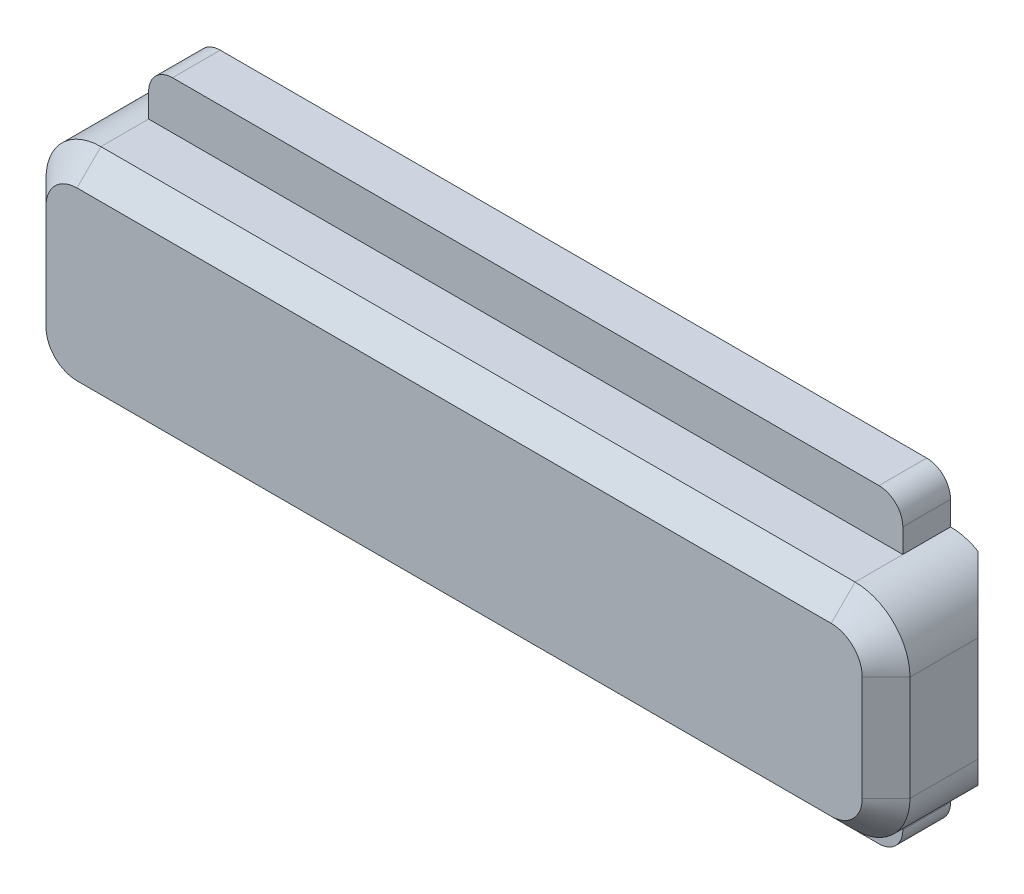
ISO-10303-21;
HEADER;
FILE_DESCRIPTION(('STEP AP214'),'2;1');
FILE_NAME('part.step','',(''),(''),'','','');
FILE_SCHEMA(('AUTOMOTIVE_DESIGN { 1 0 10303 214 1 1 1 1 }'));
ENDSEC;
DATA;
#1=APPLICATION_CONTEXT('core data for automotive mechanical design processes');
#2=APPLICATION_PROTOCOL_DEFINITION('international standard','automotive_design',2000,#1);
#3=PRODUCT_CONTEXT('',#1,'mechanical');
#4=PRODUCT('Part','Part','',(#3));
#5=PRODUCT_RELATED_PRODUCT_CATEGORY('part','',(#4));
#6=PRODUCT_DEFINITION_FORMATION('','',#4);
#7=PRODUCT_DEFINITION_CONTEXT('part definition',#1,'design');
#8=PRODUCT_DEFINITION('design','',#6,#7);
#9=PRODUCT_DEFINITION_SHAPE('','',#8);
#10=(LENGTH_UNIT() NAMED_UNIT(*) SI_UNIT(.MILLI.,.METRE.));
#11=(NAMED_UNIT(*) PLANE_ANGLE_UNIT() SI_UNIT($,.RADIAN.));
#12=(NAMED_UNIT(*) SI_UNIT($,.STERADIAN.) SOLID_ANGLE_UNIT());
#13=UNCERTAINTY_MEASURE_WITH_UNIT(LENGTH_MEASURE(1.E-05),#10,'distance_accuracy_value','');
#14=(GEOMETRIC_REPRESENTATION_CONTEXT(3) GLOBAL_UNCERTAINTY_ASSIGNED_CONTEXT((#13)) GLOBAL_UNIT_ASSIGNED_CONTEXT((#10,
#11,#12)) REPRESENTATION_CONTEXT('',''));
#15=CARTESIAN_POINT('',(0.,0.,0.));
#16=DIRECTION('',(0.,0.,1.));
#17=DIRECTION('',(1.,0.,0.));
#18=AXIS2_PLACEMENT_3D('',#15,#16,#17);
#19=CARTESIAN_POINT('',(7.9,-0.100000000000001,-2.5));
#20=DIRECTION('',(0.,1.,0.));
#21=DIRECTION('',(-1.,0.,0.));
#22=AXIS2_PLACEMENT_3D('',#19,#20,#21);
#23=PLANE('',#22);
#24=DIRECTION('',(0.,0.,1.));
#25=VECTOR('',#24,1.);
#26=CARTESIAN_POINT('',(-7.9,-0.100000000000001,-2.5));
#27=LINE('',#26,#25);
#28=CARTESIAN_POINT('',(-7.9,-0.100000000000001,-1.5));
#29=VERTEX_POINT('',#28);
#30=CARTESIAN_POINT('',(-7.9,-0.100000000000001,-0.499999999999997));
#31=VERTEX_POINT('',#30);
#32=EDGE_CURVE('E344',#29,#31,#27,.T.);
#33=ORIENTED_EDGE('',*,*,#32,.T.);
#34=DIRECTION('',(1.,0.,0.));
#35=VECTOR('',#34,1.);
#36=CARTESIAN_POINT('',(7.9,-0.100000000000001,-0.499999999999997));
#37=LINE('',#36,#35);
#38=CARTESIAN_POINT('',(7.9,-0.100000000000002,-0.499999999999997));
#39=VERTEX_POINT('',#38);
#40=EDGE_CURVE('E290',#31,#39,#37,.T.);
#41=ORIENTED_EDGE('',*,*,#40,.T.);
#42=DIRECTION('',(0.,0.,1.));
#43=VECTOR('',#42,1.);
#44=CARTESIAN_POINT('',(7.9,-0.100000000000002,-2.5));
#45=LINE('',#44,#43);
#46=CARTESIAN_POINT('',(7.9,-0.100000000000002,-1.5));
#47=VERTEX_POINT('',#46);
#48=EDGE_CURVE('E348',#47,#39,#45,.T.);
#49=ORIENTED_EDGE('',*,*,#48,.F.);
#50=DIRECTION('',(-1.,0.,0.));
#51=VECTOR('',#50,1.);
#52=CARTESIAN_POINT('',(7.9,-0.100000000000001,-1.5));
#53=LINE('',#52,#51);
#54=EDGE_CURVE('E331',#47,#29,#53,.T.);
#55=ORIENTED_EDGE('',*,*,#54,.T.);
#56=EDGE_LOOP('',(#33,#41,#49,#55));
#57=FACE_BOUND('',#56,.T.);
#58=ADVANCED_FACE('F36',(#57),#23,.T.);
#59=CARTESIAN_POINT('',(-7.9,-4.6,-2.5));
#60=DIRECTION('',(0.,-1.,0.));
#61=DIRECTION('',(0.,0.,-1.));
#62=AXIS2_PLACEMENT_3D('',#59,#60,#61);
#63=PLANE('',#62);
#64=DIRECTION('',(0.,0.,1.));
#65=VECTOR('',#64,1.);
#66=CARTESIAN_POINT('',(7.89999999999999,-4.6,-2.5));
#67=LINE('',#66,#65);
#68=CARTESIAN_POINT('',(7.9,-4.6,-1.5));
#69=VERTEX_POINT('',#68);
#70=CARTESIAN_POINT('',(7.89999999999999,-4.6,-0.499999999999997));
#71=VERTEX_POINT('',#70);
#72=EDGE_CURVE('E353',#69,#71,#67,.T.);
#73=ORIENTED_EDGE('',*,*,#72,.T.);
#74=DIRECTION('',(-1.,0.,0.));
#75=VECTOR('',#74,1.);
#76=CARTESIAN_POINT('',(-7.9,-4.6,-0.499999999999997));
#77=LINE('',#76,#75);
#78=CARTESIAN_POINT('',(-7.9,-4.6,-0.499999999999997));
#79=VERTEX_POINT('',#78);
#80=EDGE_CURVE('E279',#71,#79,#77,.T.);
#81=ORIENTED_EDGE('',*,*,#80,.T.);
#82=DIRECTION('',(0.,0.,1.));
#83=VECTOR('',#82,1.);
#84=CARTESIAN_POINT('',(-7.9,-4.6,-2.5));
#85=LINE('',#84,#83);
#86=CARTESIAN_POINT('',(-7.9,-4.6,-1.5));
#87=VERTEX_POINT('',#86);
#88=EDGE_CURVE('E216',#87,#79,#85,.T.);
#89=ORIENTED_EDGE('',*,*,#88,.F.);
#90=DIRECTION('',(1.,0.,0.));
#91=VECTOR('',#90,1.);
#92=CARTESIAN_POINT('',(-7.9,-4.6,-1.5));
#93=LINE('',#92,#91);
#94=EDGE_CURVE('E336',#87,#69,#93,.T.);
#95=ORIENTED_EDGE('',*,*,#94,.T.);
#96=EDGE_LOOP('',(#73,#81,#89,#95));
#97=FACE_BOUND('',#96,.T.);
#98=ADVANCED_FACE('F382',(#97),#63,.T.);
#99=CARTESIAN_POINT('',(-7.9,-1.25,-2.5));
#100=DIRECTION('',(0.,0.,1.));
#101=DIRECTION('',(1.,0.,0.));
#102=AXIS2_PLACEMENT_3D('',#99,#100,#101);
#103=CYLINDRICAL_SURFACE('',#102,1.15);
#104=CARTESIAN_POINT('',(-7.9,-1.25,-3.07499999999999));
#105=DIRECTION('',(0.707106781186543,0.,0.707106781186552));
#106=DIRECTION('',(-0.707106781186552,0.,0.707106781186543));
#107=AXIS2_PLACEMENT_3D('',#104,#105,#106);
#108=ELLIPSE('',#107,1.62634559672905,1.15);
#109=CARTESIAN_POINT('',(-9.05,-1.25,-1.92500000000001));
#110=VERTEX_POINT('',#109);
#111=CARTESIAN_POINT('',(-8.475,-0.25407078564789,-2.5));
#112=VERTEX_POINT('',#111);
#113=EDGE_CURVE('E51',#110,#112,#108,.F.);
#114=ORIENTED_EDGE('',*,*,#113,.F.);
#115=DIRECTION('',(0.,0.,1.));
#116=VECTOR('',#115,1.);
#117=CARTESIAN_POINT('',(-9.05000000000001,-1.25,-2.5));
#118=LINE('',#117,#116);
#119=CARTESIAN_POINT('',(-9.05000000000001,-1.25,-0.499999999999997));
#120=VERTEX_POINT('',#119);
#121=EDGE_CURVE('E209',#110,#120,#118,.T.);
#122=ORIENTED_EDGE('',*,*,#121,.T.);
#123=CARTESIAN_POINT('',(-7.9,-1.25,-0.499999999999997));
#124=DIRECTION('',(0.,0.,1.));
#125=DIRECTION('',(1.,0.,0.));
#126=AXIS2_PLACEMENT_3D('',#123,#124,#125);
#127=CIRCLE('',#126,1.15);
#128=EDGE_CURVE('E285',#120,#31,#127,.F.);
#129=ORIENTED_EDGE('',*,*,#128,.T.);
#130=ORIENTED_EDGE('',*,*,#32,.F.);
#131=CARTESIAN_POINT('',(-7.9,-0.0999999999999977,-2.5));
#132=VERTEX_POINT('',#131);
#133=EDGE_CURVE('E228',#132,#29,#27,.T.);
#134=ORIENTED_EDGE('',*,*,#133,.F.);
#135=CARTESIAN_POINT('',(-7.9,-1.25,-2.5));
#136=DIRECTION('',(0.,0.,1.));
#137=DIRECTION('',(1.,0.,0.));
#138=AXIS2_PLACEMENT_3D('',#135,#136,#137);
#139=CIRCLE('',#138,1.15);
#140=EDGE_CURVE('E324',#132,#112,#139,.T.);
#141=ORIENTED_EDGE('',*,*,#140,.T.);
#142=EDGE_LOOP('',(#114,#122,#129,#130,#134,#141));
#143=FACE_BOUND('',#142,.T.);
#144=ADVANCED_FACE('F329',(#143),#103,.T.);
#145=CARTESIAN_POINT('',(7.9,-1.25,-2.5));
#146=DIRECTION('',(0.,0.,1.));
#147=DIRECTION('',(1.,0.,0.));
#148=AXIS2_PLACEMENT_3D('',#145,#146,#147);
#149=CYLINDRICAL_SURFACE('',#148,1.15);
#150=CARTESIAN_POINT('',(7.9,-1.25,-3.07499999999999));
#151=DIRECTION('',(-0.707106781186543,0.,0.707106781186552));
#152=DIRECTION('',(0.707106781186552,0.,0.707106781186543));
#153=AXIS2_PLACEMENT_3D('',#150,#151,#152);
#154=ELLIPSE('',#153,1.62634559672905,1.15);
#155=CARTESIAN_POINT('',(8.475,-0.254070785647898,-2.5));
#156=VERTEX_POINT('',#155);
#157=CARTESIAN_POINT('',(9.05,-1.25,-1.92500000000001));
#158=VERTEX_POINT('',#157);
#159=EDGE_CURVE('E298',#156,#158,#154,.F.);
#160=ORIENTED_EDGE('',*,*,#159,.F.);
#161=CARTESIAN_POINT('',(7.9,-1.25,-2.5));
#162=DIRECTION('',(0.,0.,1.));
#163=DIRECTION('',(1.,0.,0.));
#164=AXIS2_PLACEMENT_3D('',#161,#162,#163);
#165=CIRCLE('',#164,1.15);
#166=CARTESIAN_POINT('',(7.9,-0.0999999999999977,-2.5));
#167=VERTEX_POINT('',#166);
#168=EDGE_CURVE('E220',#156,#167,#165,.T.);
#169=ORIENTED_EDGE('',*,*,#168,.T.);
#170=EDGE_CURVE('E345',#167,#47,#45,.T.);
#171=ORIENTED_EDGE('',*,*,#170,.T.);
#172=ORIENTED_EDGE('',*,*,#48,.T.);
#173=CARTESIAN_POINT('',(7.9,-1.25,-0.499999999999997));
#174=DIRECTION('',(0.,0.,1.));
#175=DIRECTION('',(1.,0.,0.));
#176=AXIS2_PLACEMENT_3D('',#173,#174,#175);
#177=CIRCLE('',#176,1.15);
#178=CARTESIAN_POINT('',(9.05,-1.25,-0.499999999999997));
#179=VERTEX_POINT('',#178);
#180=EDGE_CURVE('E292',#39,#179,#177,.F.);
#181=ORIENTED_EDGE('',*,*,#180,.T.);
#182=DIRECTION('',(0.,0.,1.));
#183=VECTOR('',#182,1.);
#184=CARTESIAN_POINT('',(9.05,-1.25,-2.5));
#185=LINE('',#184,#183);
#186=EDGE_CURVE('E349',#158,#179,#185,.T.);
#187=ORIENTED_EDGE('',*,*,#186,.F.);
#188=EDGE_LOOP('',(#160,#169,#171,#172,#181,#187));
#189=FACE_BOUND('',#188,.T.);
#190=ADVANCED_FACE('F420',(#189),#149,.T.);
#191=CARTESIAN_POINT('',(9.05,-3.45,-2.5));
#192=DIRECTION('',(1.,0.,0.));
#193=DIRECTION('',(0.,0.,-1.));
#194=AXIS2_PLACEMENT_3D('',#191,#192,#193);
#195=PLANE('',#194);
#196=DIRECTION('',(0.,1.,0.));
#197=VECTOR('',#196,1.);
#198=CARTESIAN_POINT('',(9.05,-5.6,-1.92500000000001));
#199=LINE('',#198,#197);
#200=CARTESIAN_POINT('',(9.05,-3.45,-1.92500000000001));
#201=VERTEX_POINT('',#200);
#202=EDGE_CURVE('E201',#201,#158,#199,.T.);
#203=ORIENTED_EDGE('',*,*,#202,.T.);
#204=ORIENTED_EDGE('',*,*,#186,.T.);
#205=DIRECTION('',(0.,-1.,0.));
#206=VECTOR('',#205,1.);
#207=CARTESIAN_POINT('',(9.05,-3.45,-0.499999999999997));
#208=LINE('',#207,#206);
#209=CARTESIAN_POINT('',(9.05,-3.45,-0.499999999999997));
#210=VERTEX_POINT('',#209);
#211=EDGE_CURVE('E287',#179,#210,#208,.T.);
#212=ORIENTED_EDGE('',*,*,#211,.T.);
#213=DIRECTION('',(0.,0.,1.));
#214=VECTOR('',#213,1.);
#215=CARTESIAN_POINT('',(9.05,-3.45,-2.5));
#216=LINE('',#215,#214);
#217=EDGE_CURVE('E351',#201,#210,#216,.T.);
#218=ORIENTED_EDGE('',*,*,#217,.F.);
#219=EDGE_LOOP('',(#203,#204,#212,#218));
#220=FACE_BOUND('',#219,.T.);
#221=ADVANCED_FACE('F475',(#220),#195,.T.);
#222=CARTESIAN_POINT('',(7.9,-3.45,-2.5));
#223=DIRECTION('',(0.,0.,1.));
#224=DIRECTION('',(1.,0.,0.));
#225=AXIS2_PLACEMENT_3D('',#222,#223,#224);
#226=CYLINDRICAL_SURFACE('',#225,1.15);
#227=CARTESIAN_POINT('',(7.9,-3.45,-3.07499999999999));
#228=DIRECTION('',(-0.707106781186543,0.,0.707106781186552));
#229=DIRECTION('',(0.707106781186552,0.,0.707106781186543));
#230=AXIS2_PLACEMENT_3D('',#227,#228,#229);
#231=ELLIPSE('',#230,1.62634559672905,1.15);
#232=CARTESIAN_POINT('',(8.475,-4.44592921435211,-2.5));
#233=VERTEX_POINT('',#232);
#234=EDGE_CURVE('E59',#201,#233,#231,.F.);
#235=ORIENTED_EDGE('',*,*,#234,.F.);
#236=ORIENTED_EDGE('',*,*,#217,.T.);
#237=CARTESIAN_POINT('',(7.9,-3.45,-0.499999999999997));
#238=DIRECTION('',(0.,0.,1.));
#239=DIRECTION('',(1.,0.,0.));
#240=AXIS2_PLACEMENT_3D('',#237,#238,#239);
#241=CIRCLE('',#240,1.15);
#242=EDGE_CURVE('E283',#210,#71,#241,.F.);
#243=ORIENTED_EDGE('',*,*,#242,.T.);
#244=ORIENTED_EDGE('',*,*,#72,.F.);
#245=CARTESIAN_POINT('',(7.9,-4.6,-2.5));
#246=VERTEX_POINT('',#245);
#247=EDGE_CURVE('E352',#246,#69,#67,.T.);
#248=ORIENTED_EDGE('',*,*,#247,.F.);
#249=CARTESIAN_POINT('',(7.9,-3.45,-2.5));
#250=DIRECTION('',(0.,0.,1.));
#251=DIRECTION('',(-1.,0.,0.));
#252=AXIS2_PLACEMENT_3D('',#249,#250,#251);
#253=CIRCLE('',#252,1.15);
#254=EDGE_CURVE('E333',#246,#233,#253,.T.);
#255=ORIENTED_EDGE('',*,*,#254,.T.);
#256=EDGE_LOOP('',(#235,#236,#243,#244,#248,#255));
#257=FACE_BOUND('',#256,.T.);
#258=ADVANCED_FACE('F461',(#257),#226,.T.);
#259=CARTESIAN_POINT('',(-7.90000000000001,-3.45,-2.5));
#260=DIRECTION('',(0.,0.,1.));
#261=DIRECTION('',(1.,0.,0.));
#262=AXIS2_PLACEMENT_3D('',#259,#260,#261);
#263=CYLINDRICAL_SURFACE('',#262,1.15);
#264=CARTESIAN_POINT('',(-7.90000000000001,-3.45,-3.07499999999999));
#265=DIRECTION('',(0.707106781186543,0.,0.707106781186552));
#266=DIRECTION('',(-0.707106781186552,0.,0.707106781186543));
#267=AXIS2_PLACEMENT_3D('',#264,#265,#266);
#268=ELLIPSE('',#267,1.62634559672905,1.15);
#269=CARTESIAN_POINT('',(-8.475,-4.44592921435211,-2.5));
#270=VERTEX_POINT('',#269);
#271=CARTESIAN_POINT('',(-9.05,-3.44999999999999,-1.92500000000001));
#272=VERTEX_POINT('',#271);
#273=EDGE_CURVE('E194',#270,#272,#268,.F.);
#274=ORIENTED_EDGE('',*,*,#273,.F.);
#275=CARTESIAN_POINT('',(-7.90000000000001,-3.45,-2.5));
#276=DIRECTION('',(0.,0.,1.));
#277=DIRECTION('',(-1.,0.,0.));
#278=AXIS2_PLACEMENT_3D('',#275,#276,#277);
#279=CIRCLE('',#278,1.15);
#280=CARTESIAN_POINT('',(-7.9,-4.6,-2.5));
#281=VERTEX_POINT('',#280);
#282=EDGE_CURVE('E326',#270,#281,#279,.T.);
#283=ORIENTED_EDGE('',*,*,#282,.T.);
#284=EDGE_CURVE('E218',#281,#87,#85,.T.);
#285=ORIENTED_EDGE('',*,*,#284,.T.);
#286=ORIENTED_EDGE('',*,*,#88,.T.);
#287=CARTESIAN_POINT('',(-7.90000000000001,-3.45,-0.499999999999997));
#288=DIRECTION('',(0.,0.,1.));
#289=DIRECTION('',(1.,0.,0.));
#290=AXIS2_PLACEMENT_3D('',#287,#288,#289);
#291=CIRCLE('',#290,1.15);
#292=CARTESIAN_POINT('',(-9.05000000000001,-3.44999999999999,-0.499999999999997));
#293=VERTEX_POINT('',#292);
#294=EDGE_CURVE('E215',#79,#293,#291,.F.);
#295=ORIENTED_EDGE('',*,*,#294,.T.);
#296=DIRECTION('',(0.,0.,1.));
#297=VECTOR('',#296,1.);
#298=CARTESIAN_POINT('',(-9.05000000000001,-3.44999999999999,-2.5));
#299=LINE('',#298,#297);
#300=EDGE_CURVE('E207',#272,#293,#299,.T.);
#301=ORIENTED_EDGE('',*,*,#300,.F.);
#302=EDGE_LOOP('',(#274,#283,#285,#286,#295,#301));
#303=FACE_BOUND('',#302,.T.);
#304=ADVANCED_FACE('F212',(#303),#263,.T.);
#305=CARTESIAN_POINT('',(-9.05000000000001,-1.25,-2.5));
#306=DIRECTION('',(-1.,0.,0.));
#307=DIRECTION('',(0.,0.,1.));
#308=AXIS2_PLACEMENT_3D('',#305,#306,#307);
#309=PLANE('',#308);
#310=DIRECTION('',(0.,1.,0.));
#311=VECTOR('',#310,1.);
#312=CARTESIAN_POINT('',(-9.05,-5.6,-1.92500000000001));
#313=LINE('',#312,#311);
#314=EDGE_CURVE('E197',#272,#110,#313,.T.);
#315=ORIENTED_EDGE('',*,*,#314,.F.);
#316=ORIENTED_EDGE('',*,*,#300,.T.);
#317=DIRECTION('',(0.,1.,0.));
#318=VECTOR('',#317,1.);
#319=CARTESIAN_POINT('',(-9.05000000000001,-1.25,-0.499999999999997));
#320=LINE('',#319,#318);
#321=EDGE_CURVE('E281',#293,#120,#320,.T.);
#322=ORIENTED_EDGE('',*,*,#321,.T.);
#323=ORIENTED_EDGE('',*,*,#121,.F.);
#324=EDGE_LOOP('',(#315,#316,#322,#323));
#325=FACE_BOUND('',#324,.T.);
#326=ADVANCED_FACE('F205',(#325),#309,.T.);
#327=CARTESIAN_POINT('',(-7.9,-1.25,-2.5));
#328=DIRECTION('',(0.,0.,1.));
#329=DIRECTION('',(1.,0.,0.));
#330=AXIS2_PLACEMENT_3D('',#327,#328,#329);
#331=PLANE('',#330);
#332=ORIENTED_EDGE('',*,*,#168,.F.);
#333=DIRECTION('',(0.,-1.,0.));
#334=VECTOR('',#333,1.);
#335=CARTESIAN_POINT('',(8.475,-1.25,-2.5));
#336=LINE('',#335,#334);
#337=EDGE_CURVE('E11',#156,#233,#336,.T.);
#338=ORIENTED_EDGE('',*,*,#337,.T.);
#339=ORIENTED_EDGE('',*,*,#254,.F.);
#340=DIRECTION('',(0.,-1.,0.));
#341=VECTOR('',#340,1.);
#342=CARTESIAN_POINT('',(7.9,0.899999999999998,-2.5));
#343=LINE('',#342,#341);
#344=CARTESIAN_POINT('',(7.9,-5.1,-2.5));
#345=VERTEX_POINT('',#344);
#346=EDGE_CURVE('E454',#246,#345,#343,.T.);
#347=ORIENTED_EDGE('',*,*,#346,.T.);
#348=CARTESIAN_POINT('',(7.4,-5.1,-2.5));
#349=DIRECTION('',(0.,0.,1.));
#350=DIRECTION('',(1.,0.,0.));
#351=AXIS2_PLACEMENT_3D('',#348,#349,#350);
#352=CIRCLE('',#351,0.5);
#353=CARTESIAN_POINT('',(7.4,-5.6,-2.5));
#354=VERTEX_POINT('',#353);
#355=EDGE_CURVE('E227',#345,#354,#352,.F.);
#356=ORIENTED_EDGE('',*,*,#355,.T.);
#357=DIRECTION('',(-1.,0.,0.));
#358=VECTOR('',#357,1.);
#359=CARTESIAN_POINT('',(7.9,-5.6,-2.5));
#360=LINE('',#359,#358);
#361=CARTESIAN_POINT('',(-7.4,-5.6,-2.5));
#362=VERTEX_POINT('',#361);
#363=EDGE_CURVE('E440',#354,#362,#360,.T.);
#364=ORIENTED_EDGE('',*,*,#363,.T.);
#365=CARTESIAN_POINT('',(-7.4,-5.1,-2.5));
#366=DIRECTION('',(0.,0.,1.));
#367=DIRECTION('',(1.,0.,0.));
#368=AXIS2_PLACEMENT_3D('',#365,#366,#367);
#369=CIRCLE('',#368,0.5);
#370=CARTESIAN_POINT('',(-7.9,-5.1,-2.5));
#371=VERTEX_POINT('',#370);
#372=EDGE_CURVE('E230',#362,#371,#369,.F.);
#373=ORIENTED_EDGE('',*,*,#372,.T.);
#374=DIRECTION('',(0.,1.,0.));
#375=VECTOR('',#374,1.);
#376=CARTESIAN_POINT('',(-7.9,0.899999999999998,-2.5));
#377=LINE('',#376,#375);
#378=EDGE_CURVE('E369',#371,#281,#377,.T.);
#379=ORIENTED_EDGE('',*,*,#378,.T.);
#380=ORIENTED_EDGE('',*,*,#282,.F.);
#381=DIRECTION('',(0.,1.,0.));
#382=VECTOR('',#381,1.);
#383=CARTESIAN_POINT('',(-8.475,-1.25,-2.5));
#384=LINE('',#383,#382);
#385=EDGE_CURVE('E44',#270,#112,#384,.T.);
#386=ORIENTED_EDGE('',*,*,#385,.T.);
#387=ORIENTED_EDGE('',*,*,#140,.F.);
#388=CARTESIAN_POINT('',(-7.9,0.399999999999998,-2.5));
#389=VERTEX_POINT('',#388);
#390=EDGE_CURVE('E317',#132,#389,#377,.T.);
#391=ORIENTED_EDGE('',*,*,#390,.T.);
#392=CARTESIAN_POINT('',(-7.4,0.399999999999998,-2.5));
#393=DIRECTION('',(0.,0.,1.));
#394=DIRECTION('',(1.,0.,0.));
#395=AXIS2_PLACEMENT_3D('',#392,#393,#394);
#396=CIRCLE('',#395,0.5);
#397=CARTESIAN_POINT('',(-7.4,0.899999999999998,-2.5));
#398=VERTEX_POINT('',#397);
#399=EDGE_CURVE('E234',#389,#398,#396,.F.);
#400=ORIENTED_EDGE('',*,*,#399,.T.);
#401=DIRECTION('',(1.,0.,0.));
#402=VECTOR('',#401,1.);
#403=CARTESIAN_POINT('',(7.9,0.899999999999998,-2.5));
#404=LINE('',#403,#402);
#405=CARTESIAN_POINT('',(7.4,0.899999999999998,-2.5));
#406=VERTEX_POINT('',#405);
#407=EDGE_CURVE('E451',#398,#406,#404,.T.);
#408=ORIENTED_EDGE('',*,*,#407,.T.);
#409=CARTESIAN_POINT('',(7.4,0.399999999999998,-2.5));
#410=DIRECTION('',(0.,0.,1.));
#411=DIRECTION('',(1.,0.,0.));
#412=AXIS2_PLACEMENT_3D('',#409,#410,#411);
#413=CIRCLE('',#412,0.5);
#414=CARTESIAN_POINT('',(7.9,0.399999999999998,-2.5));
#415=VERTEX_POINT('',#414);
#416=EDGE_CURVE('E232',#406,#415,#413,.F.);
#417=ORIENTED_EDGE('',*,*,#416,.T.);
#418=EDGE_CURVE('E426',#415,#167,#343,.T.);
#419=ORIENTED_EDGE('',*,*,#418,.T.);
#420=EDGE_LOOP('',(#332,#338,#339,#347,#356,#364,#373,#379,#380,#386,#387,#391,#400,#408,#417,#419));
#421=FACE_BOUND('',#420,.T.);
#422=ADVANCED_FACE('F322',(#421),#331,.F.);
#423=CARTESIAN_POINT('',(-7.9,-1.25,0.));
#424=DIRECTION('',(0.,0.,1.));
#425=DIRECTION('',(1.,0.,0.));
#426=AXIS2_PLACEMENT_3D('',#423,#424,#425);
#427=PLANE('',#426);
#428=DIRECTION('',(0.,-1.,0.));
#429=VECTOR('',#428,1.);
#430=CARTESIAN_POINT('',(-8.55000000000001,-1.25,0.));
#431=LINE('',#430,#429);
#432=CARTESIAN_POINT('',(-8.55000000000001,-1.25,0.));
#433=VERTEX_POINT('',#432);
#434=CARTESIAN_POINT('',(-8.55000000000001,-3.45,0.));
#435=VERTEX_POINT('',#434);
#436=EDGE_CURVE('E271',#433,#435,#431,.T.);
#437=ORIENTED_EDGE('',*,*,#436,.T.);
#438=CARTESIAN_POINT('',(-7.90000000000001,-3.45,0.));
#439=DIRECTION('',(0.,0.,1.));
#440=DIRECTION('',(1.,0.,0.));
#441=AXIS2_PLACEMENT_3D('',#438,#439,#440);
#442=CIRCLE('',#441,0.650000000000006);
#443=CARTESIAN_POINT('',(-7.9,-4.10000000000001,0.));
#444=VERTEX_POINT('',#443);
#445=EDGE_CURVE('E275',#435,#444,#442,.T.);
#446=ORIENTED_EDGE('',*,*,#445,.T.);
#447=DIRECTION('',(1.,0.,0.));
#448=VECTOR('',#447,1.);
#449=CARTESIAN_POINT('',(-7.9,-4.10000000000001,0.));
#450=LINE('',#449,#448);
#451=CARTESIAN_POINT('',(7.89999999999999,-4.10000000000001,0.));
#452=VERTEX_POINT('',#451);
#453=EDGE_CURVE('E273',#444,#452,#450,.T.);
#454=ORIENTED_EDGE('',*,*,#453,.T.);
#455=CARTESIAN_POINT('',(7.9,-3.45,0.));
#456=DIRECTION('',(0.,0.,1.));
#457=DIRECTION('',(1.,0.,0.));
#458=AXIS2_PLACEMENT_3D('',#455,#456,#457);
#459=CIRCLE('',#458,0.650000000000006);
#460=CARTESIAN_POINT('',(8.55,-3.45,0.));
#461=VERTEX_POINT('',#460);
#462=EDGE_CURVE('E269',#452,#461,#459,.T.);
#463=ORIENTED_EDGE('',*,*,#462,.T.);
#464=DIRECTION('',(0.,1.,0.));
#465=VECTOR('',#464,1.);
#466=CARTESIAN_POINT('',(8.55,-1.25,0.));
#467=LINE('',#466,#465);
#468=CARTESIAN_POINT('',(8.55,-1.25,0.));
#469=VERTEX_POINT('',#468);
#470=EDGE_CURVE('E265',#461,#469,#467,.T.);
#471=ORIENTED_EDGE('',*,*,#470,.T.);
#472=CARTESIAN_POINT('',(7.9,-1.25,0.));
#473=DIRECTION('',(0.,0.,1.));
#474=DIRECTION('',(1.,0.,0.));
#475=AXIS2_PLACEMENT_3D('',#472,#473,#474);
#476=CIRCLE('',#475,0.650000000000006);
#477=CARTESIAN_POINT('',(7.9,-0.599999999999995,0.));
#478=VERTEX_POINT('',#477);
#479=EDGE_CURVE('E261',#469,#478,#476,.T.);
#480=ORIENTED_EDGE('',*,*,#479,.T.);
#481=DIRECTION('',(-1.,0.,0.));
#482=VECTOR('',#481,1.);
#483=CARTESIAN_POINT('',(-7.9,-0.599999999999994,0.));
#484=LINE('',#483,#482);
#485=CARTESIAN_POINT('',(-7.9,-0.599999999999994,0.));
#486=VERTEX_POINT('',#485);
#487=EDGE_CURVE('E263',#478,#486,#484,.T.);
#488=ORIENTED_EDGE('',*,*,#487,.T.);
#489=CARTESIAN_POINT('',(-7.9,-1.25,0.));
#490=DIRECTION('',(0.,0.,1.));
#491=DIRECTION('',(1.,0.,0.));
#492=AXIS2_PLACEMENT_3D('',#489,#490,#491);
#493=CIRCLE('',#492,0.650000000000008);
#494=EDGE_CURVE('E267',#486,#433,#493,.T.);
#495=ORIENTED_EDGE('',*,*,#494,.T.);
#496=EDGE_LOOP('',(#437,#446,#454,#463,#471,#480,#488,#495));
#497=FACE_BOUND('',#496,.T.);
#498=ADVANCED_FACE('F470',(#497),#427,.T.);
#499=CARTESIAN_POINT('',(7.9,-5.6,-1.5));
#500=DIRECTION('',(0.,-1.,0.));
#501=DIRECTION('',(0.,0.,-1.));
#502=AXIS2_PLACEMENT_3D('',#499,#500,#501);
#503=PLANE('',#502);
#504=DIRECTION('',(-1.,0.,0.));
#505=VECTOR('',#504,1.);
#506=CARTESIAN_POINT('',(7.9,-5.6,-1.5));
#507=LINE('',#506,#505);
#508=CARTESIAN_POINT('',(7.4,-5.6,-1.5));
#509=VERTEX_POINT('',#508);
#510=CARTESIAN_POINT('',(-7.4,-5.6,-1.5));
#511=VERTEX_POINT('',#510);
#512=EDGE_CURVE('E381',#509,#511,#507,.T.);
#513=ORIENTED_EDGE('',*,*,#512,.T.);
#514=DIRECTION('',(0.,0.,-1.));
#515=VECTOR('',#514,1.);
#516=CARTESIAN_POINT('',(-7.4,-5.6,-1.5));
#517=LINE('',#516,#515);
#518=EDGE_CURVE('E249',#511,#362,#517,.T.);
#519=ORIENTED_EDGE('',*,*,#518,.T.);
#520=ORIENTED_EDGE('',*,*,#363,.F.);
#521=DIRECTION('',(0.,0.,-1.));
#522=VECTOR('',#521,1.);
#523=CARTESIAN_POINT('',(7.4,-5.6,-1.5));
#524=LINE('',#523,#522);
#525=EDGE_CURVE('E247',#354,#509,#524,.F.);
#526=ORIENTED_EDGE('',*,*,#525,.T.);
#527=EDGE_LOOP('',(#513,#519,#520,#526));
#528=FACE_BOUND('',#527,.T.);
#529=ADVANCED_FACE('F599',(#528),#503,.T.);
#530=CARTESIAN_POINT('',(-7.9,0.899999999999998,-1.5));
#531=DIRECTION('',(-1.,0.,0.));
#532=DIRECTION('',(0.,0.,1.));
#533=AXIS2_PLACEMENT_3D('',#530,#531,#532);
#534=PLANE('',#533);
#535=ORIENTED_EDGE('',*,*,#378,.F.);
#536=DIRECTION('',(0.,0.,-1.));
#537=VECTOR('',#536,1.);
#538=CARTESIAN_POINT('',(-7.9,-5.1,-1.5));
#539=LINE('',#538,#537);
#540=CARTESIAN_POINT('',(-7.9,-5.1,-1.5));
#541=VERTEX_POINT('',#540);
#542=EDGE_CURVE('E252',#371,#541,#539,.F.);
#543=ORIENTED_EDGE('',*,*,#542,.T.);
#544=DIRECTION('',(0.,1.,0.));
#545=VECTOR('',#544,1.);
#546=CARTESIAN_POINT('',(-7.9,0.899999999999998,-1.5));
#547=LINE('',#546,#545);
#548=EDGE_CURVE('E372',#541,#87,#547,.T.);
#549=ORIENTED_EDGE('',*,*,#548,.T.);
#550=ORIENTED_EDGE('',*,*,#284,.F.);
#551=EDGE_LOOP('',(#535,#543,#549,#550));
#552=FACE_BOUND('',#551,.T.);
#553=ADVANCED_FACE('F368',(#552),#534,.T.);
#554=CARTESIAN_POINT('',(0.,0.,-1.5));
#555=DIRECTION('',(0.,0.,-1.));
#556=DIRECTION('',(-1.,0.,0.));
#557=AXIS2_PLACEMENT_3D('',#554,#555,#556);
#558=PLANE('',#557);
#559=ORIENTED_EDGE('',*,*,#548,.F.);
#560=CARTESIAN_POINT('',(-7.4,-5.1,-1.5));
#561=DIRECTION('',(0.,0.,-1.));
#562=DIRECTION('',(-1.,0.,0.));
#563=AXIS2_PLACEMENT_3D('',#560,#561,#562);
#564=CIRCLE('',#563,0.5);
#565=EDGE_CURVE('E256',#541,#511,#564,.F.);
#566=ORIENTED_EDGE('',*,*,#565,.T.);
#567=ORIENTED_EDGE('',*,*,#512,.F.);
#568=CARTESIAN_POINT('',(7.4,-5.1,-1.5));
#569=DIRECTION('',(0.,0.,-1.));
#570=DIRECTION('',(-1.,0.,0.));
#571=AXIS2_PLACEMENT_3D('',#568,#569,#570);
#572=CIRCLE('',#571,0.5);
#573=CARTESIAN_POINT('',(7.9,-5.1,-1.5));
#574=VERTEX_POINT('',#573);
#575=EDGE_CURVE('E254',#509,#574,#572,.F.);
#576=ORIENTED_EDGE('',*,*,#575,.T.);
#577=DIRECTION('',(0.,-1.,0.));
#578=VECTOR('',#577,1.);
#579=CARTESIAN_POINT('',(7.9,0.899999999999998,-1.5));
#580=LINE('',#579,#578);
#581=EDGE_CURVE('E380',#69,#574,#580,.T.);
#582=ORIENTED_EDGE('',*,*,#581,.F.);
#583=ORIENTED_EDGE('',*,*,#94,.F.);
#584=EDGE_LOOP('',(#559,#566,#567,#576,#582,#583));
#585=FACE_BOUND('',#584,.T.);
#586=ADVANCED_FACE('F379',(#585),#558,.F.);
#587=CARTESIAN_POINT('',(7.9,0.899999999999998,-1.5));
#588=DIRECTION('',(1.,0.,0.));
#589=DIRECTION('',(0.,0.,-1.));
#590=AXIS2_PLACEMENT_3D('',#587,#588,#589);
#591=PLANE('',#590);
#592=ORIENTED_EDGE('',*,*,#581,.T.);
#593=DIRECTION('',(0.,0.,-1.));
#594=VECTOR('',#593,1.);
#595=CARTESIAN_POINT('',(7.9,-5.1,-1.5));
#596=LINE('',#595,#594);
#597=EDGE_CURVE('E258',#574,#345,#596,.T.);
#598=ORIENTED_EDGE('',*,*,#597,.T.);
#599=ORIENTED_EDGE('',*,*,#346,.F.);
#600=ORIENTED_EDGE('',*,*,#247,.T.);
#601=EDGE_LOOP('',(#592,#598,#599,#600));
#602=FACE_BOUND('',#601,.T.);
#603=ADVANCED_FACE('F458',(#602),#591,.T.);
#604=DIRECTION('',(1.,0.,0.));
#605=VECTOR('',#604,1.);
#606=CARTESIAN_POINT('',(7.9,0.899999999999998,-1.5));
#607=LINE('',#606,#605);
#608=CARTESIAN_POINT('',(-7.4,0.899999999999998,-1.5));
#609=VERTEX_POINT('',#608);
#610=CARTESIAN_POINT('',(7.4,0.899999999999998,-1.5));
#611=VERTEX_POINT('',#610);
#612=EDGE_CURVE('E376',#609,#611,#607,.T.);
#613=ORIENTED_EDGE('',*,*,#612,.F.);
#614=CARTESIAN_POINT('',(-7.4,0.399999999999998,-1.5));
#615=DIRECTION('',(0.,0.,-1.));
#616=DIRECTION('',(-1.,0.,0.));
#617=AXIS2_PLACEMENT_3D('',#614,#615,#616);
#618=CIRCLE('',#617,0.5);
#619=CARTESIAN_POINT('',(-7.9,0.399999999999998,-1.5));
#620=VERTEX_POINT('',#619);
#621=EDGE_CURVE('E243',#609,#620,#618,.F.);
#622=ORIENTED_EDGE('',*,*,#621,.T.);
#623=EDGE_CURVE('E377',#29,#620,#547,.T.);
#624=ORIENTED_EDGE('',*,*,#623,.F.);
#625=ORIENTED_EDGE('',*,*,#54,.F.);
#626=CARTESIAN_POINT('',(7.9,0.399999999999998,-1.5));
#627=VERTEX_POINT('',#626);
#628=EDGE_CURVE('E429',#627,#47,#580,.T.);
#629=ORIENTED_EDGE('',*,*,#628,.F.);
#630=CARTESIAN_POINT('',(7.4,0.399999999999998,-1.5));
#631=DIRECTION('',(0.,0.,-1.));
#632=DIRECTION('',(-1.,0.,0.));
#633=AXIS2_PLACEMENT_3D('',#630,#631,#632);
#634=CIRCLE('',#633,0.5);
#635=EDGE_CURVE('E241',#627,#611,#634,.F.);
#636=ORIENTED_EDGE('',*,*,#635,.T.);
#637=EDGE_LOOP('',(#613,#622,#624,#625,#629,#636));
#638=FACE_BOUND('',#637,.T.);
#639=ADVANCED_FACE('F435',(#638),#558,.F.);
#640=ORIENTED_EDGE('',*,*,#623,.T.);
#641=DIRECTION('',(0.,0.,-1.));
#642=VECTOR('',#641,1.);
#643=CARTESIAN_POINT('',(-7.9,0.399999999999998,-1.5));
#644=LINE('',#643,#642);
#645=EDGE_CURVE('E224',#620,#389,#644,.T.);
#646=ORIENTED_EDGE('',*,*,#645,.T.);
#647=ORIENTED_EDGE('',*,*,#390,.F.);
#648=ORIENTED_EDGE('',*,*,#133,.T.);
#649=EDGE_LOOP('',(#640,#646,#647,#648));
#650=FACE_BOUND('',#649,.T.);
#651=ADVANCED_FACE('F570',(#650),#534,.T.);
#652=ORIENTED_EDGE('',*,*,#418,.F.);
#653=DIRECTION('',(0.,0.,-1.));
#654=VECTOR('',#653,1.);
#655=CARTESIAN_POINT('',(7.9,0.399999999999998,-1.5));
#656=LINE('',#655,#654);
#657=EDGE_CURVE('E245',#415,#627,#656,.F.);
#658=ORIENTED_EDGE('',*,*,#657,.T.);
#659=ORIENTED_EDGE('',*,*,#628,.T.);
#660=ORIENTED_EDGE('',*,*,#170,.F.);
#661=EDGE_LOOP('',(#652,#658,#659,#660));
#662=FACE_BOUND('',#661,.T.);
#663=ADVANCED_FACE('F425',(#662),#591,.T.);
#664=CARTESIAN_POINT('',(7.9,0.899999999999998,-1.5));
#665=DIRECTION('',(0.,1.,0.));
#666=DIRECTION('',(0.,0.,1.));
#667=AXIS2_PLACEMENT_3D('',#664,#665,#666);
#668=PLANE('',#667);
#669=ORIENTED_EDGE('',*,*,#407,.F.);
#670=DIRECTION('',(0.,0.,-1.));
#671=VECTOR('',#670,1.);
#672=CARTESIAN_POINT('',(-7.4,0.899999999999998,-1.5));
#673=LINE('',#672,#671);
#674=EDGE_CURVE('E239',#398,#609,#673,.F.);
#675=ORIENTED_EDGE('',*,*,#674,.T.);
#676=ORIENTED_EDGE('',*,*,#612,.T.);
#677=DIRECTION('',(0.,0.,-1.));
#678=VECTOR('',#677,1.);
#679=CARTESIAN_POINT('',(7.4,0.899999999999998,-1.5));
#680=LINE('',#679,#678);
#681=EDGE_CURVE('E236',#611,#406,#680,.T.);
#682=ORIENTED_EDGE('',*,*,#681,.T.);
#683=EDGE_LOOP('',(#669,#675,#676,#682));
#684=FACE_BOUND('',#683,.T.);
#685=ADVANCED_FACE('F510',(#684),#668,.T.);
#686=CARTESIAN_POINT('',(-7.4,0.399999999999998,-1.5));
#687=DIRECTION('',(0.,0.,-1.));
#688=DIRECTION('',(-1.,0.,0.));
#689=AXIS2_PLACEMENT_3D('',#686,#687,#688);
#690=CYLINDRICAL_SURFACE('',#689,0.5);
#691=ORIENTED_EDGE('',*,*,#621,.F.);
#692=ORIENTED_EDGE('',*,*,#674,.F.);
#693=ORIENTED_EDGE('',*,*,#399,.F.);
#694=ORIENTED_EDGE('',*,*,#645,.F.);
#695=EDGE_LOOP('',(#691,#692,#693,#694));
#696=FACE_BOUND('',#695,.T.);
#697=ADVANCED_FACE('F506',(#696),#690,.T.);
#698=CARTESIAN_POINT('',(7.4,0.399999999999998,-1.5));
#699=DIRECTION('',(0.,0.,-1.));
#700=DIRECTION('',(-1.,0.,0.));
#701=AXIS2_PLACEMENT_3D('',#698,#699,#700);
#702=CYLINDRICAL_SURFACE('',#701,0.5);
#703=ORIENTED_EDGE('',*,*,#635,.F.);
#704=ORIENTED_EDGE('',*,*,#657,.F.);
#705=ORIENTED_EDGE('',*,*,#416,.F.);
#706=ORIENTED_EDGE('',*,*,#681,.F.);
#707=EDGE_LOOP('',(#703,#704,#705,#706));
#708=FACE_BOUND('',#707,.T.);
#709=ADVANCED_FACE('F509',(#708),#702,.T.);
#710=CARTESIAN_POINT('',(-7.4,-5.1,-1.5));
#711=DIRECTION('',(0.,0.,-1.));
#712=DIRECTION('',(-1.,0.,0.));
#713=AXIS2_PLACEMENT_3D('',#710,#711,#712);
#714=CYLINDRICAL_SURFACE('',#713,0.5);
#715=ORIENTED_EDGE('',*,*,#565,.F.);
#716=ORIENTED_EDGE('',*,*,#542,.F.);
#717=ORIENTED_EDGE('',*,*,#372,.F.);
#718=ORIENTED_EDGE('',*,*,#518,.F.);
#719=EDGE_LOOP('',(#715,#716,#717,#718));
#720=FACE_BOUND('',#719,.T.);
#721=ADVANCED_FACE('F514',(#720),#714,.T.);
#722=CARTESIAN_POINT('',(7.4,-5.1,-1.5));
#723=DIRECTION('',(0.,0.,-1.));
#724=DIRECTION('',(-1.,0.,0.));
#725=AXIS2_PLACEMENT_3D('',#722,#723,#724);
#726=CYLINDRICAL_SURFACE('',#725,0.5);
#727=ORIENTED_EDGE('',*,*,#575,.F.);
#728=ORIENTED_EDGE('',*,*,#525,.F.);
#729=ORIENTED_EDGE('',*,*,#355,.F.);
#730=ORIENTED_EDGE('',*,*,#597,.F.);
#731=EDGE_LOOP('',(#727,#728,#729,#730));
#732=FACE_BOUND('',#731,.T.);
#733=ADVANCED_FACE('F518',(#732),#726,.T.);
#734=CARTESIAN_POINT('',(7.9,-1.25,0.));
#735=DIRECTION('',(0.,0.,-1.));
#736=DIRECTION('',(-1.,0.,0.));
#737=AXIS2_PLACEMENT_3D('',#734,#735,#736);
#738=CONICAL_SURFACE('',#737,0.650000000000006,0.785398163397444);
#739=DIRECTION('',(-0.707106781186544,0.,0.707106781186551));
#740=VECTOR('',#739,1.);
#741=CARTESIAN_POINT('',(9.05,-1.25,-0.499999999999997));
#742=LINE('',#741,#740);
#743=EDGE_CURVE('E312',#179,#469,#742,.T.);
#744=ORIENTED_EDGE('',*,*,#743,.F.);
#745=ORIENTED_EDGE('',*,*,#180,.F.);
#746=DIRECTION('',(0.,0.707106781186544,-0.707106781186551));
#747=VECTOR('',#746,1.);
#748=CARTESIAN_POINT('',(7.9,-0.599999999999995,0.));
#749=LINE('',#748,#747);
#750=EDGE_CURVE('E315',#478,#39,#749,.T.);
#751=ORIENTED_EDGE('',*,*,#750,.F.);
#752=ORIENTED_EDGE('',*,*,#479,.F.);
#753=EDGE_LOOP('',(#744,#745,#751,#752));
#754=FACE_BOUND('',#753,.T.);
#755=ADVANCED_FACE('F38',(#754),#738,.T.);
#756=CARTESIAN_POINT('',(-7.9,-0.599999999999994,0.));
#757=DIRECTION('',(0.,-0.70710678118655,-0.707106781186545));
#758=DIRECTION('',(-1.,0.,0.));
#759=AXIS2_PLACEMENT_3D('',#756,#757,#758);
#760=PLANE('',#759);
#761=ORIENTED_EDGE('',*,*,#750,.T.);
#762=ORIENTED_EDGE('',*,*,#40,.F.);
#763=DIRECTION('',(0.,0.707106781186545,-0.70710678118655));
#764=VECTOR('',#763,1.);
#765=CARTESIAN_POINT('',(-7.9,-0.599999999999994,0.));
#766=LINE('',#765,#764);
#767=EDGE_CURVE('E309',#486,#31,#766,.T.);
#768=ORIENTED_EDGE('',*,*,#767,.F.);
#769=ORIENTED_EDGE('',*,*,#487,.F.);
#770=EDGE_LOOP('',(#761,#762,#768,#769));
#771=FACE_BOUND('',#770,.T.);
#772=ADVANCED_FACE('F409',(#771),#760,.F.);
#773=CARTESIAN_POINT('',(8.55,-1.25,0.));
#774=DIRECTION('',(-0.70710678118655,0.,-0.707106781186545));
#775=DIRECTION('',(0.,1.,0.));
#776=AXIS2_PLACEMENT_3D('',#773,#774,#775);
#777=PLANE('',#776);
#778=ORIENTED_EDGE('',*,*,#743,.T.);
#779=ORIENTED_EDGE('',*,*,#470,.F.);
#780=DIRECTION('',(-0.707106781186545,0.,0.70710678118655));
#781=VECTOR('',#780,1.);
#782=CARTESIAN_POINT('',(9.05,-3.45,-0.499999999999997));
#783=LINE('',#782,#781);
#784=EDGE_CURVE('E306',#210,#461,#783,.T.);
#785=ORIENTED_EDGE('',*,*,#784,.F.);
#786=ORIENTED_EDGE('',*,*,#211,.F.);
#787=EDGE_LOOP('',(#778,#779,#785,#786));
#788=FACE_BOUND('',#787,.T.);
#789=ADVANCED_FACE('F472',(#788),#777,.F.);
#790=CARTESIAN_POINT('',(-7.9,-1.25,0.));
#791=DIRECTION('',(0.,0.,-1.));
#792=DIRECTION('',(-1.,0.,0.));
#793=AXIS2_PLACEMENT_3D('',#790,#791,#792);
#794=CONICAL_SURFACE('',#793,0.650000000000008,0.785398163397444);
#795=ORIENTED_EDGE('',*,*,#767,.T.);
#796=ORIENTED_EDGE('',*,*,#128,.F.);
#797=DIRECTION('',(-0.707106781186545,0.,-0.70710678118655));
#798=VECTOR('',#797,1.);
#799=CARTESIAN_POINT('',(-8.55000000000001,-1.25,0.));
#800=LINE('',#799,#798);
#801=EDGE_CURVE('E303',#433,#120,#800,.T.);
#802=ORIENTED_EDGE('',*,*,#801,.F.);
#803=ORIENTED_EDGE('',*,*,#494,.F.);
#804=EDGE_LOOP('',(#795,#796,#802,#803));
#805=FACE_BOUND('',#804,.T.);
#806=ADVANCED_FACE('F399',(#805),#794,.T.);
#807=CARTESIAN_POINT('',(7.9,-3.45,0.));
#808=DIRECTION('',(0.,0.,-1.));
#809=DIRECTION('',(-1.,0.,0.));
#810=AXIS2_PLACEMENT_3D('',#807,#808,#809);
#811=CONICAL_SURFACE('',#810,0.650000000000006,0.785398163397445);
#812=ORIENTED_EDGE('',*,*,#784,.T.);
#813=ORIENTED_EDGE('',*,*,#462,.F.);
#814=DIRECTION('',(0.,0.707106781186544,0.707106781186551));
#815=VECTOR('',#814,1.);
#816=CARTESIAN_POINT('',(7.89999999999999,-4.6,-0.499999999999997));
#817=LINE('',#816,#815);
#818=EDGE_CURVE('E300',#71,#452,#817,.T.);
#819=ORIENTED_EDGE('',*,*,#818,.F.);
#820=ORIENTED_EDGE('',*,*,#242,.F.);
#821=EDGE_LOOP('',(#812,#813,#819,#820));
#822=FACE_BOUND('',#821,.T.);
#823=ADVANCED_FACE('F465',(#822),#811,.T.);
#824=CARTESIAN_POINT('',(-8.55000000000001,-1.25,0.));
#825=DIRECTION('',(0.70710678118655,0.,-0.707106781186545));
#826=DIRECTION('',(0.,-1.,0.));
#827=AXIS2_PLACEMENT_3D('',#824,#825,#826);
#828=PLANE('',#827);
#829=ORIENTED_EDGE('',*,*,#801,.T.);
#830=ORIENTED_EDGE('',*,*,#321,.F.);
#831=DIRECTION('',(-0.707106781186545,0.,-0.70710678118655));
#832=VECTOR('',#831,1.);
#833=CARTESIAN_POINT('',(-8.55000000000001,-3.45,0.));
#834=LINE('',#833,#832);
#835=EDGE_CURVE('E297',#435,#293,#834,.T.);
#836=ORIENTED_EDGE('',*,*,#835,.F.);
#837=ORIENTED_EDGE('',*,*,#436,.F.);
#838=EDGE_LOOP('',(#829,#830,#836,#837));
#839=FACE_BOUND('',#838,.T.);
#840=ADVANCED_FACE('F395',(#839),#828,.F.);
#841=CARTESIAN_POINT('',(-7.9,-4.10000000000001,0.));
#842=DIRECTION('',(0.,0.70710678118655,-0.707106781186545));
#843=DIRECTION('',(1.,0.,0.));
#844=AXIS2_PLACEMENT_3D('',#841,#842,#843);
#845=PLANE('',#844);
#846=ORIENTED_EDGE('',*,*,#818,.T.);
#847=ORIENTED_EDGE('',*,*,#453,.F.);
#848=DIRECTION('',(0.,0.707106781186545,0.70710678118655));
#849=VECTOR('',#848,1.);
#850=CARTESIAN_POINT('',(-7.9,-4.6,-0.499999999999997));
#851=LINE('',#850,#849);
#852=EDGE_CURVE('E295',#79,#444,#851,.T.);
#853=ORIENTED_EDGE('',*,*,#852,.F.);
#854=ORIENTED_EDGE('',*,*,#80,.F.);
#855=EDGE_LOOP('',(#846,#847,#853,#854));
#856=FACE_BOUND('',#855,.T.);
#857=ADVANCED_FACE('F386',(#856),#845,.F.);
#858=CARTESIAN_POINT('',(-7.90000000000001,-3.45,0.));
#859=DIRECTION('',(0.,0.,-1.));
#860=DIRECTION('',(-1.,0.,0.));
#861=AXIS2_PLACEMENT_3D('',#858,#859,#860);
#862=CONICAL_SURFACE('',#861,0.650000000000006,0.785398163397444);
#863=ORIENTED_EDGE('',*,*,#835,.T.);
#864=ORIENTED_EDGE('',*,*,#294,.F.);
#865=ORIENTED_EDGE('',*,*,#852,.T.);
#866=ORIENTED_EDGE('',*,*,#445,.F.);
#867=EDGE_LOOP('',(#863,#864,#865,#866));
#868=FACE_BOUND('',#867,.T.);
#869=ADVANCED_FACE('F390',(#868),#862,.T.);
#870=CARTESIAN_POINT('',(-8.475,-5.6,-2.5));
#871=DIRECTION('',(0.707106781186543,0.,0.707106781186552));
#872=DIRECTION('',(0.707106781186552,0.,-0.707106781186543));
#873=AXIS2_PLACEMENT_3D('',#870,#871,#872);
#874=PLANE('',#873);
#875=ORIENTED_EDGE('',*,*,#113,.T.);
#876=ORIENTED_EDGE('',*,*,#385,.F.);
#877=ORIENTED_EDGE('',*,*,#273,.T.);
#878=ORIENTED_EDGE('',*,*,#314,.T.);
#879=EDGE_LOOP('',(#875,#876,#877,#878));
#880=FACE_BOUND('',#879,.T.);
#881=ADVANCED_FACE('F196',(#880),#874,.F.);
#882=CARTESIAN_POINT('',(8.475,-5.6,-2.5));
#883=DIRECTION('',(-0.707106781186543,0.,0.707106781186552));
#884=DIRECTION('',(0.707106781186552,0.,0.707106781186543));
#885=AXIS2_PLACEMENT_3D('',#882,#883,#884);
#886=PLANE('',#885);
#887=ORIENTED_EDGE('',*,*,#159,.T.);
#888=ORIENTED_EDGE('',*,*,#202,.F.);
#889=ORIENTED_EDGE('',*,*,#234,.T.);
#890=ORIENTED_EDGE('',*,*,#337,.F.);
#891=EDGE_LOOP('',(#887,#888,#889,#890));
#892=FACE_BOUND('',#891,.T.);
#893=ADVANCED_FACE('F478',(#892),#886,.F.);
#894=CLOSED_SHELL('',(#58,#98,#144,#190,#221,#258,#304,#326,#422,#498,#529,#553,#586,#603,#639,
#651,#663,#685,#697,#709,#721,#733,#755,#772,#789,#806,#823,#840,#857,#869,#881,#893));
#895=MANIFOLD_SOLID_BREP('B2',#894);
#896=ADVANCED_BREP_SHAPE_REPRESENTATION('',(#18,#895),#14);
#897=SHAPE_DEFINITION_REPRESENTATION(#9,#896);
ENDSEC;
END-ISO-10303-21;
